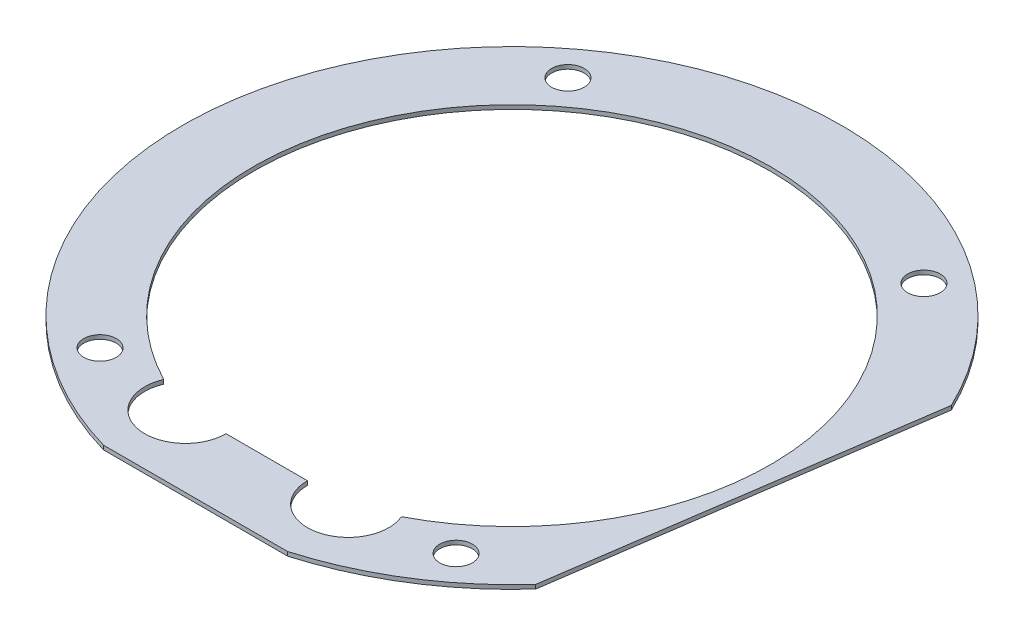
ISO-10303-21;
HEADER;
FILE_DESCRIPTION(('STEP AP214'),'2;1');
FILE_NAME('part.step','',(''),(''),'','','');
FILE_SCHEMA(('AUTOMOTIVE_DESIGN { 1 0 10303 214 1 1 1 1 }'));
ENDSEC;
DATA;
#1=APPLICATION_CONTEXT('core data for automotive mechanical design processes');
#2=APPLICATION_PROTOCOL_DEFINITION('international standard','automotive_design',2000,#1);
#3=PRODUCT_CONTEXT('',#1,'mechanical');
#4=PRODUCT('Part','Part','',(#3));
#5=PRODUCT_RELATED_PRODUCT_CATEGORY('part','',(#4));
#6=PRODUCT_DEFINITION_FORMATION('','',#4);
#7=PRODUCT_DEFINITION_CONTEXT('part definition',#1,'design');
#8=PRODUCT_DEFINITION('design','',#6,#7);
#9=PRODUCT_DEFINITION_SHAPE('','',#8);
#10=(LENGTH_UNIT() NAMED_UNIT(*) SI_UNIT(.MILLI.,.METRE.));
#11=(NAMED_UNIT(*) PLANE_ANGLE_UNIT() SI_UNIT($,.RADIAN.));
#12=(NAMED_UNIT(*) SI_UNIT($,.STERADIAN.) SOLID_ANGLE_UNIT());
#13=UNCERTAINTY_MEASURE_WITH_UNIT(LENGTH_MEASURE(1.E-05),#10,'distance_accuracy_value','');
#14=(GEOMETRIC_REPRESENTATION_CONTEXT(3) GLOBAL_UNCERTAINTY_ASSIGNED_CONTEXT((#13)) GLOBAL_UNIT_ASSIGNED_CONTEXT((#10,
#11,#12)) REPRESENTATION_CONTEXT('',''));
#15=CARTESIAN_POINT('',(0.,0.,0.));
#16=DIRECTION('',(0.,0.,1.));
#17=DIRECTION('',(1.,0.,0.));
#18=AXIS2_PLACEMENT_3D('',#15,#16,#17);
#19=CARTESIAN_POINT('',(0.,0.4,0.));
#20=DIRECTION('',(0.,1.,0.));
#21=DIRECTION('',(0.,0.,1.));
#22=AXIS2_PLACEMENT_3D('',#19,#20,#21);
#23=PLANE('',#22);
#24=CARTESIAN_POINT('',(17.5,0.4,23.));
#25=DIRECTION('',(0.,1.,0.));
#26=DIRECTION('',(0.,0.,1.));
#27=AXIS2_PLACEMENT_3D('',#24,#25,#26);
#28=CIRCLE('',#27,1.6);
#29=CARTESIAN_POINT('',(17.5,0.4,24.6));
#30=VERTEX_POINT('',#29);
#31=EDGE_CURVE('E251',#30,#30,#28,.T.);
#32=ORIENTED_EDGE('',*,*,#31,.F.);
#33=EDGE_LOOP('',(#32));
#34=FACE_BOUND('',#33,.T.);
#35=CARTESIAN_POINT('',(-17.5,0.4,-23.));
#36=DIRECTION('',(0.,1.,0.));
#37=DIRECTION('',(0.,0.,1.));
#38=AXIS2_PLACEMENT_3D('',#35,#36,#37);
#39=CIRCLE('',#38,1.6);
#40=CARTESIAN_POINT('',(-17.5,0.4,-21.4));
#41=VERTEX_POINT('',#40);
#42=EDGE_CURVE('E133',#41,#41,#39,.T.);
#43=ORIENTED_EDGE('',*,*,#42,.F.);
#44=EDGE_LOOP('',(#43));
#45=FACE_BOUND('',#44,.T.);
#46=CARTESIAN_POINT('',(0.,0.4,0.));
#47=DIRECTION('',(0.,1.,0.));
#48=DIRECTION('',(0.,0.,1.));
#49=AXIS2_PLACEMENT_3D('',#46,#47,#48);
#50=CIRCLE('',#49,32.4);
#51=CARTESIAN_POINT('',(29.2378436045863,0.4,-13.9609634822869));
#52=VERTEX_POINT('',#51);
#53=CARTESIAN_POINT('',(-9.06081428788635,0.4,31.1072603171741));
#54=VERTEX_POINT('',#53);
#55=EDGE_CURVE('E143',#52,#54,#50,.T.);
#56=ORIENTED_EDGE('',*,*,#55,.T.);
#57=DIRECTION('',(1.,0.,0.));
#58=VECTOR('',#57,1.);
#59=CARTESIAN_POINT('',(-9.06081428788635,0.4,31.1072603171741));
#60=LINE('',#59,#58);
#61=CARTESIAN_POINT('',(9.06081428788635,0.4,31.1072603171741));
#62=VERTEX_POINT('',#61);
#63=EDGE_CURVE('E146',#54,#62,#60,.T.);
#64=ORIENTED_EDGE('',*,*,#63,.T.);
#65=CARTESIAN_POINT('',(0.,0.4,0.));
#66=DIRECTION('',(0.,1.,0.));
#67=DIRECTION('',(0.,0.,1.));
#68=AXIS2_PLACEMENT_3D('',#65,#66,#67);
#69=CIRCLE('',#68,32.4);
#70=CARTESIAN_POINT('',(24.0490796532106,0.4,21.711788683421));
#71=VERTEX_POINT('',#70);
#72=EDGE_CURVE('E149',#62,#71,#69,.T.);
#73=ORIENTED_EDGE('',*,*,#72,.T.);
#74=DIRECTION('',(0.143939845714111,0.,-0.989586439284511));
#75=VECTOR('',#74,1.);
#76=CARTESIAN_POINT('',(29.2378436045863,0.4,-13.9609634822869));
#77=LINE('',#76,#75);
#78=EDGE_CURVE('E151',#71,#52,#77,.T.);
#79=ORIENTED_EDGE('',*,*,#78,.T.);
#80=EDGE_LOOP('',(#56,#64,#73,#79));
#81=FACE_BOUND('',#80,.T.);
#82=DIRECTION('',(1.,0.,0.));
#83=VECTOR('',#82,1.);
#84=CARTESIAN_POINT('',(-3.99999999999967,0.4,24.1072603171741));
#85=LINE('',#84,#83);
#86=CARTESIAN_POINT('',(-3.99999999999967,0.4,24.1072603171741));
#87=VERTEX_POINT('',#86);
#88=CARTESIAN_POINT('',(4.00000000000031,0.4,24.1072603171741));
#89=VERTEX_POINT('',#88);
#90=EDGE_CURVE('E112',#87,#89,#85,.T.);
#91=ORIENTED_EDGE('',*,*,#90,.F.);
#92=CARTESIAN_POINT('',(-7.99999999999963,0.4,24.1072603171741));
#93=DIRECTION('',(0.,1.,0.));
#94=DIRECTION('',(0.,0.,-1.));
#95=AXIS2_PLACEMENT_3D('',#92,#93,#94);
#96=CIRCLE('',#95,3.99999999999998);
#97=CARTESIAN_POINT('',(-11.6854315282744,0.4,22.5523987637238));
#98=VERTEX_POINT('',#97);
#99=EDGE_CURVE('E104',#98,#87,#96,.T.);
#100=ORIENTED_EDGE('',*,*,#99,.F.);
#101=CARTESIAN_POINT('',(0.,0.4,0.));
#102=DIRECTION('',(0.,1.,0.));
#103=DIRECTION('',(0.,0.,1.));
#104=AXIS2_PLACEMENT_3D('',#101,#102,#103);
#105=CIRCLE('',#104,25.4);
#106=CARTESIAN_POINT('',(11.685431528275,0.4,22.5523987637235));
#107=VERTEX_POINT('',#106);
#108=EDGE_CURVE('E127',#107,#98,#105,.T.);
#109=ORIENTED_EDGE('',*,*,#108,.F.);
#110=CARTESIAN_POINT('',(8.00000000000034,0.4,24.1072603171741));
#111=DIRECTION('',(0.,1.,0.));
#112=DIRECTION('',(0.,0.,1.));
#113=AXIS2_PLACEMENT_3D('',#110,#111,#112);
#114=CIRCLE('',#113,4.00000000000001);
#115=EDGE_CURVE('E125',#89,#107,#114,.T.);
#116=ORIENTED_EDGE('',*,*,#115,.F.);
#117=EDGE_LOOP('',(#91,#100,#109,#116));
#118=FACE_BOUND('',#117,.T.);
#119=CARTESIAN_POINT('',(-17.5,0.4,23.));
#120=DIRECTION('',(0.,1.,0.));
#121=DIRECTION('',(0.,0.,1.));
#122=AXIS2_PLACEMENT_3D('',#119,#120,#121);
#123=CIRCLE('',#122,1.6);
#124=CARTESIAN_POINT('',(-17.5,0.4,24.6));
#125=VERTEX_POINT('',#124);
#126=EDGE_CURVE('E257',#125,#125,#123,.T.);
#127=ORIENTED_EDGE('',*,*,#126,.F.);
#128=EDGE_LOOP('',(#127));
#129=FACE_BOUND('',#128,.T.);
#130=CARTESIAN_POINT('',(17.5,0.4,-23.));
#131=DIRECTION('',(0.,1.,0.));
#132=DIRECTION('',(0.,0.,1.));
#133=AXIS2_PLACEMENT_3D('',#130,#131,#132);
#134=CIRCLE('',#133,1.6);
#135=CARTESIAN_POINT('',(17.5,0.4,-21.4));
#136=VERTEX_POINT('',#135);
#137=EDGE_CURVE('E242',#136,#136,#134,.T.);
#138=ORIENTED_EDGE('',*,*,#137,.F.);
#139=EDGE_LOOP('',(#138));
#140=FACE_BOUND('',#139,.T.);
#141=ADVANCED_FACE('F39',(#34,#45,#81,#118,#129,#140),#23,.T.);
#142=CARTESIAN_POINT('',(0.,0.,0.));
#143=DIRECTION('',(0.,1.,0.));
#144=DIRECTION('',(0.,0.,1.));
#145=AXIS2_PLACEMENT_3D('',#142,#143,#144);
#146=PLANE('',#145);
#147=CARTESIAN_POINT('',(0.,0.,0.));
#148=DIRECTION('',(0.,1.,0.));
#149=DIRECTION('',(0.,0.,1.));
#150=AXIS2_PLACEMENT_3D('',#147,#148,#149);
#151=CIRCLE('',#150,32.4);
#152=CARTESIAN_POINT('',(29.2378436045863,0.,-13.9609634822869));
#153=VERTEX_POINT('',#152);
#154=CARTESIAN_POINT('',(-9.06081428788635,0.,31.1072603171741));
#155=VERTEX_POINT('',#154);
#156=EDGE_CURVE('E120',#153,#155,#151,.T.);
#157=ORIENTED_EDGE('',*,*,#156,.F.);
#158=DIRECTION('',(0.143939845714111,0.,-0.989586439284511));
#159=VECTOR('',#158,1.);
#160=CARTESIAN_POINT('',(29.2378436045863,0.,-13.9609634822869));
#161=LINE('',#160,#159);
#162=CARTESIAN_POINT('',(24.0490796532106,0.,21.711788683421));
#163=VERTEX_POINT('',#162);
#164=EDGE_CURVE('E147',#163,#153,#161,.T.);
#165=ORIENTED_EDGE('',*,*,#164,.F.);
#166=CARTESIAN_POINT('',(0.,0.,0.));
#167=DIRECTION('',(0.,1.,0.));
#168=DIRECTION('',(0.,0.,1.));
#169=AXIS2_PLACEMENT_3D('',#166,#167,#168);
#170=CIRCLE('',#169,32.4);
#171=CARTESIAN_POINT('',(9.06081428788635,0.,31.1072603171741));
#172=VERTEX_POINT('',#171);
#173=EDGE_CURVE('E158',#172,#163,#170,.T.);
#174=ORIENTED_EDGE('',*,*,#173,.F.);
#175=DIRECTION('',(1.,0.,0.));
#176=VECTOR('',#175,1.);
#177=CARTESIAN_POINT('',(-9.06081428788635,0.,31.1072603171741));
#178=LINE('',#177,#176);
#179=EDGE_CURVE('E156',#155,#172,#178,.T.);
#180=ORIENTED_EDGE('',*,*,#179,.F.);
#181=EDGE_LOOP('',(#157,#165,#174,#180));
#182=FACE_BOUND('',#181,.T.);
#183=CARTESIAN_POINT('',(-7.99999999999963,0.,24.1072603171741));
#184=DIRECTION('',(0.,1.,0.));
#185=DIRECTION('',(0.,0.,-1.));
#186=AXIS2_PLACEMENT_3D('',#183,#184,#185);
#187=CIRCLE('',#186,3.99999999999998);
#188=CARTESIAN_POINT('',(-11.6854315282744,0.,22.5523987637238));
#189=VERTEX_POINT('',#188);
#190=CARTESIAN_POINT('',(-3.99999999999967,0.,24.1072603171741));
#191=VERTEX_POINT('',#190);
#192=EDGE_CURVE('E62',#189,#191,#187,.T.);
#193=ORIENTED_EDGE('',*,*,#192,.T.);
#194=DIRECTION('',(1.,0.,0.));
#195=VECTOR('',#194,1.);
#196=CARTESIAN_POINT('',(-3.99999999999967,0.,24.1072603171741));
#197=LINE('',#196,#195);
#198=CARTESIAN_POINT('',(4.00000000000031,0.,24.1072603171741));
#199=VERTEX_POINT('',#198);
#200=EDGE_CURVE('E119',#191,#199,#197,.T.);
#201=ORIENTED_EDGE('',*,*,#200,.T.);
#202=CARTESIAN_POINT('',(8.00000000000034,0.,24.1072603171741));
#203=DIRECTION('',(0.,1.,0.));
#204=DIRECTION('',(0.,0.,1.));
#205=AXIS2_PLACEMENT_3D('',#202,#203,#204);
#206=CIRCLE('',#205,4.00000000000001);
#207=CARTESIAN_POINT('',(11.685431528275,0.,22.5523987637235));
#208=VERTEX_POINT('',#207);
#209=EDGE_CURVE('E135',#199,#208,#206,.T.);
#210=ORIENTED_EDGE('',*,*,#209,.T.);
#211=CARTESIAN_POINT('',(0.,0.,0.));
#212=DIRECTION('',(0.,1.,0.));
#213=DIRECTION('',(0.,0.,1.));
#214=AXIS2_PLACEMENT_3D('',#211,#212,#213);
#215=CIRCLE('',#214,25.4);
#216=EDGE_CURVE('E113',#208,#189,#215,.T.);
#217=ORIENTED_EDGE('',*,*,#216,.T.);
#218=EDGE_LOOP('',(#193,#201,#210,#217));
#219=FACE_BOUND('',#218,.T.);
#220=CARTESIAN_POINT('',(-17.5,0.,-23.));
#221=DIRECTION('',(0.,1.,0.));
#222=DIRECTION('',(0.,0.,1.));
#223=AXIS2_PLACEMENT_3D('',#220,#221,#222);
#224=CIRCLE('',#223,1.6);
#225=CARTESIAN_POINT('',(-17.5,0.,-21.4));
#226=VERTEX_POINT('',#225);
#227=EDGE_CURVE('E260',#226,#226,#224,.T.);
#228=ORIENTED_EDGE('',*,*,#227,.T.);
#229=EDGE_LOOP('',(#228));
#230=FACE_BOUND('',#229,.T.);
#231=CARTESIAN_POINT('',(-17.5,0.,23.));
#232=DIRECTION('',(0.,1.,0.));
#233=DIRECTION('',(0.,0.,1.));
#234=AXIS2_PLACEMENT_3D('',#231,#232,#233);
#235=CIRCLE('',#234,1.6);
#236=CARTESIAN_POINT('',(-17.5,0.,24.6));
#237=VERTEX_POINT('',#236);
#238=EDGE_CURVE('E254',#237,#237,#235,.T.);
#239=ORIENTED_EDGE('',*,*,#238,.T.);
#240=EDGE_LOOP('',(#239));
#241=FACE_BOUND('',#240,.T.);
#242=CARTESIAN_POINT('',(17.5,0.,23.));
#243=DIRECTION('',(0.,1.,0.));
#244=DIRECTION('',(0.,0.,1.));
#245=AXIS2_PLACEMENT_3D('',#242,#243,#244);
#246=CIRCLE('',#245,1.6);
#247=CARTESIAN_POINT('',(17.5,0.,24.6));
#248=VERTEX_POINT('',#247);
#249=EDGE_CURVE('E248',#248,#248,#246,.T.);
#250=ORIENTED_EDGE('',*,*,#249,.T.);
#251=EDGE_LOOP('',(#250));
#252=FACE_BOUND('',#251,.T.);
#253=CARTESIAN_POINT('',(17.5,0.,-23.));
#254=DIRECTION('',(0.,1.,0.));
#255=DIRECTION('',(0.,0.,1.));
#256=AXIS2_PLACEMENT_3D('',#253,#254,#255);
#257=CIRCLE('',#256,1.6);
#258=CARTESIAN_POINT('',(17.5,0.,-21.4));
#259=VERTEX_POINT('',#258);
#260=EDGE_CURVE('E245',#259,#259,#257,.T.);
#261=ORIENTED_EDGE('',*,*,#260,.T.);
#262=EDGE_LOOP('',(#261));
#263=FACE_BOUND('',#262,.T.);
#264=ADVANCED_FACE('F176',(#182,#219,#230,#241,#252,#263),#146,.F.);
#265=CARTESIAN_POINT('',(0.,0.4,0.));
#266=DIRECTION('',(0.,-1.,0.));
#267=DIRECTION('',(0.,0.,-1.));
#268=AXIS2_PLACEMENT_3D('',#265,#266,#267);
#269=CYLINDRICAL_SURFACE('',#268,32.4);
#270=ORIENTED_EDGE('',*,*,#156,.T.);
#271=DIRECTION('',(0.,-1.,0.));
#272=VECTOR('',#271,1.);
#273=CARTESIAN_POINT('',(-9.06081428788635,0.4,31.1072603171741));
#274=LINE('',#273,#272);
#275=EDGE_CURVE('E11',#54,#155,#274,.T.);
#276=ORIENTED_EDGE('',*,*,#275,.F.);
#277=ORIENTED_EDGE('',*,*,#55,.F.);
#278=DIRECTION('',(0.,-1.,0.));
#279=VECTOR('',#278,1.);
#280=CARTESIAN_POINT('',(29.2378436045863,0.4,-13.9609634822869));
#281=LINE('',#280,#279);
#282=EDGE_CURVE('E153',#52,#153,#281,.T.);
#283=ORIENTED_EDGE('',*,*,#282,.T.);
#284=EDGE_LOOP('',(#270,#276,#277,#283));
#285=FACE_BOUND('',#284,.T.);
#286=ADVANCED_FACE('F41',(#285),#269,.T.);
#287=CARTESIAN_POINT('',(-9.06081428788635,0.4,31.1072603171741));
#288=DIRECTION('',(0.,0.,-1.));
#289=DIRECTION('',(-1.,0.,0.));
#290=AXIS2_PLACEMENT_3D('',#287,#288,#289);
#291=PLANE('',#290);
#292=ORIENTED_EDGE('',*,*,#179,.T.);
#293=DIRECTION('',(0.,-1.,0.));
#294=VECTOR('',#293,1.);
#295=CARTESIAN_POINT('',(9.06081428788635,0.4,31.1072603171741));
#296=LINE('',#295,#294);
#297=EDGE_CURVE('E47',#62,#172,#296,.T.);
#298=ORIENTED_EDGE('',*,*,#297,.F.);
#299=ORIENTED_EDGE('',*,*,#63,.F.);
#300=ORIENTED_EDGE('',*,*,#275,.T.);
#301=EDGE_LOOP('',(#292,#298,#299,#300));
#302=FACE_BOUND('',#301,.T.);
#303=ADVANCED_FACE('F186',(#302),#291,.F.);
#304=CARTESIAN_POINT('',(0.,0.4,0.));
#305=DIRECTION('',(0.,-1.,0.));
#306=DIRECTION('',(0.,0.,-1.));
#307=AXIS2_PLACEMENT_3D('',#304,#305,#306);
#308=CYLINDRICAL_SURFACE('',#307,32.4);
#309=ORIENTED_EDGE('',*,*,#173,.T.);
#310=DIRECTION('',(0.,-1.,0.));
#311=VECTOR('',#310,1.);
#312=CARTESIAN_POINT('',(24.0490796532106,0.4,21.711788683421));
#313=LINE('',#312,#311);
#314=EDGE_CURVE('E163',#71,#163,#313,.T.);
#315=ORIENTED_EDGE('',*,*,#314,.F.);
#316=ORIENTED_EDGE('',*,*,#72,.F.);
#317=ORIENTED_EDGE('',*,*,#297,.T.);
#318=EDGE_LOOP('',(#309,#315,#316,#317));
#319=FACE_BOUND('',#318,.T.);
#320=ADVANCED_FACE('F170',(#319),#308,.T.);
#321=CARTESIAN_POINT('',(29.2378436045863,0.4,-13.9609634822869));
#322=DIRECTION('',(-0.989586439284511,0.,-0.143939845714111));
#323=DIRECTION('',(-0.143939845714111,0.,0.989586439284511));
#324=AXIS2_PLACEMENT_3D('',#321,#322,#323);
#325=PLANE('',#324);
#326=ORIENTED_EDGE('',*,*,#164,.T.);
#327=ORIENTED_EDGE('',*,*,#282,.F.);
#328=ORIENTED_EDGE('',*,*,#78,.F.);
#329=ORIENTED_EDGE('',*,*,#314,.T.);
#330=EDGE_LOOP('',(#326,#327,#328,#329));
#331=FACE_BOUND('',#330,.T.);
#332=ADVANCED_FACE('F180',(#331),#325,.F.);
#333=CARTESIAN_POINT('',(-7.99999999999963,0.4,24.1072603171741));
#334=DIRECTION('',(0.,-1.,0.));
#335=DIRECTION('',(0.,0.,-1.));
#336=AXIS2_PLACEMENT_3D('',#333,#334,#335);
#337=CYLINDRICAL_SURFACE('',#336,3.99999999999998);
#338=ORIENTED_EDGE('',*,*,#192,.F.);
#339=DIRECTION('',(0.,-1.,0.));
#340=VECTOR('',#339,1.);
#341=CARTESIAN_POINT('',(-11.6854315282744,0.4,22.5523987637238));
#342=LINE('',#341,#340);
#343=EDGE_CURVE('E108',#98,#189,#342,.T.);
#344=ORIENTED_EDGE('',*,*,#343,.F.);
#345=ORIENTED_EDGE('',*,*,#99,.T.);
#346=DIRECTION('',(0.,-1.,0.));
#347=VECTOR('',#346,1.);
#348=CARTESIAN_POINT('',(-3.99999999999967,0.4,24.1072603171741));
#349=LINE('',#348,#347);
#350=EDGE_CURVE('E107',#87,#191,#349,.T.);
#351=ORIENTED_EDGE('',*,*,#350,.T.);
#352=EDGE_LOOP('',(#338,#344,#345,#351));
#353=FACE_BOUND('',#352,.T.);
#354=ADVANCED_FACE('F106',(#353),#337,.F.);
#355=CARTESIAN_POINT('',(-3.99999999999967,0.4,24.1072603171741));
#356=DIRECTION('',(0.,0.,-1.));
#357=DIRECTION('',(-1.,0.,0.));
#358=AXIS2_PLACEMENT_3D('',#355,#356,#357);
#359=PLANE('',#358);
#360=ORIENTED_EDGE('',*,*,#200,.F.);
#361=ORIENTED_EDGE('',*,*,#350,.F.);
#362=ORIENTED_EDGE('',*,*,#90,.T.);
#363=DIRECTION('',(0.,-1.,0.));
#364=VECTOR('',#363,1.);
#365=CARTESIAN_POINT('',(4.00000000000031,0.4,24.1072603171741));
#366=LINE('',#365,#364);
#367=EDGE_CURVE('E121',#89,#199,#366,.T.);
#368=ORIENTED_EDGE('',*,*,#367,.T.);
#369=EDGE_LOOP('',(#360,#361,#362,#368));
#370=FACE_BOUND('',#369,.T.);
#371=ADVANCED_FACE('F116',(#370),#359,.T.);
#372=CARTESIAN_POINT('',(8.00000000000034,0.4,24.1072603171741));
#373=DIRECTION('',(0.,-1.,0.));
#374=DIRECTION('',(0.,0.,-1.));
#375=AXIS2_PLACEMENT_3D('',#372,#373,#374);
#376=CYLINDRICAL_SURFACE('',#375,4.00000000000001);
#377=ORIENTED_EDGE('',*,*,#209,.F.);
#378=ORIENTED_EDGE('',*,*,#367,.F.);
#379=ORIENTED_EDGE('',*,*,#115,.T.);
#380=DIRECTION('',(0.,-1.,0.));
#381=VECTOR('',#380,1.);
#382=CARTESIAN_POINT('',(11.685431528275,0.4,22.5523987637235));
#383=LINE('',#382,#381);
#384=EDGE_CURVE('E54',#107,#208,#383,.T.);
#385=ORIENTED_EDGE('',*,*,#384,.T.);
#386=EDGE_LOOP('',(#377,#378,#379,#385));
#387=FACE_BOUND('',#386,.T.);
#388=ADVANCED_FACE('F212',(#387),#376,.F.);
#389=CARTESIAN_POINT('',(0.,0.4,0.));
#390=DIRECTION('',(0.,-1.,0.));
#391=DIRECTION('',(0.,0.,-1.));
#392=AXIS2_PLACEMENT_3D('',#389,#390,#391);
#393=CYLINDRICAL_SURFACE('',#392,25.4);
#394=ORIENTED_EDGE('',*,*,#216,.F.);
#395=ORIENTED_EDGE('',*,*,#384,.F.);
#396=ORIENTED_EDGE('',*,*,#108,.T.);
#397=ORIENTED_EDGE('',*,*,#343,.T.);
#398=EDGE_LOOP('',(#394,#395,#396,#397));
#399=FACE_BOUND('',#398,.T.);
#400=ADVANCED_FACE('F216',(#399),#393,.F.);
#401=CARTESIAN_POINT('',(-17.5,0.4,-23.));
#402=DIRECTION('',(0.,-1.,0.));
#403=DIRECTION('',(0.,0.,-1.));
#404=AXIS2_PLACEMENT_3D('',#401,#402,#403);
#405=CYLINDRICAL_SURFACE('',#404,1.6);
#406=ORIENTED_EDGE('',*,*,#42,.T.);
#407=EDGE_LOOP('',(#406));
#408=FACE_BOUND('',#407,.T.);
#409=ORIENTED_EDGE('',*,*,#227,.F.);
#410=EDGE_LOOP('',(#409));
#411=FACE_BOUND('',#410,.T.);
#412=ADVANCED_FACE('F222',(#408,#411),#405,.F.);
#413=CARTESIAN_POINT('',(-17.5,0.4,23.));
#414=DIRECTION('',(0.,-1.,0.));
#415=DIRECTION('',(0.,0.,-1.));
#416=AXIS2_PLACEMENT_3D('',#413,#414,#415);
#417=CYLINDRICAL_SURFACE('',#416,1.6);
#418=ORIENTED_EDGE('',*,*,#126,.T.);
#419=EDGE_LOOP('',(#418));
#420=FACE_BOUND('',#419,.T.);
#421=ORIENTED_EDGE('',*,*,#238,.F.);
#422=EDGE_LOOP('',(#421));
#423=FACE_BOUND('',#422,.T.);
#424=ADVANCED_FACE('F225',(#420,#423),#417,.F.);
#425=CARTESIAN_POINT('',(17.5,0.4,23.));
#426=DIRECTION('',(0.,-1.,0.));
#427=DIRECTION('',(0.,0.,-1.));
#428=AXIS2_PLACEMENT_3D('',#425,#426,#427);
#429=CYLINDRICAL_SURFACE('',#428,1.6);
#430=ORIENTED_EDGE('',*,*,#31,.T.);
#431=EDGE_LOOP('',(#430));
#432=FACE_BOUND('',#431,.T.);
#433=ORIENTED_EDGE('',*,*,#249,.F.);
#434=EDGE_LOOP('',(#433));
#435=FACE_BOUND('',#434,.T.);
#436=ADVANCED_FACE('F229',(#432,#435),#429,.F.);
#437=CARTESIAN_POINT('',(17.5,0.4,-23.));
#438=DIRECTION('',(0.,-1.,0.));
#439=DIRECTION('',(0.,0.,-1.));
#440=AXIS2_PLACEMENT_3D('',#437,#438,#439);
#441=CYLINDRICAL_SURFACE('',#440,1.6);
#442=ORIENTED_EDGE('',*,*,#137,.T.);
#443=EDGE_LOOP('',(#442));
#444=FACE_BOUND('',#443,.T.);
#445=ORIENTED_EDGE('',*,*,#260,.F.);
#446=EDGE_LOOP('',(#445));
#447=FACE_BOUND('',#446,.T.);
#448=ADVANCED_FACE('F233',(#444,#447),#441,.F.);
#449=CLOSED_SHELL('',(#141,#264,#286,#303,#320,#332,#354,#371,#388,#400,#412,#424,#436,#448));
#450=MANIFOLD_SOLID_BREP('B2',#449);
#451=ADVANCED_BREP_SHAPE_REPRESENTATION('',(#18,#450),#14);
#452=SHAPE_DEFINITION_REPRESENTATION(#9,#451);
ENDSEC;
END-ISO-10303-21;
